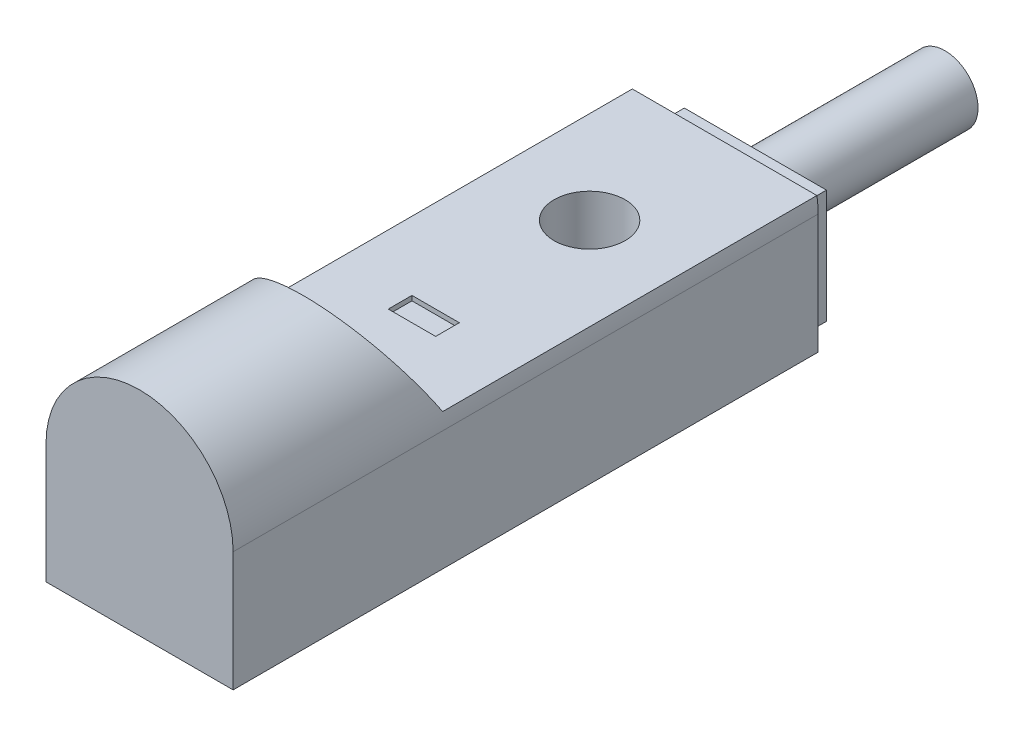
ISO-10303-21;
HEADER;
FILE_DESCRIPTION(('STEP AP214'),'2;1');
FILE_NAME('part.step','',(''),(''),'','','');
FILE_SCHEMA(('AUTOMOTIVE_DESIGN { 1 0 10303 214 1 1 1 1 }'));
ENDSEC;
DATA;
#1=APPLICATION_CONTEXT('core data for automotive mechanical design processes');
#2=APPLICATION_PROTOCOL_DEFINITION('international standard','automotive_design',2000,#1);
#3=PRODUCT_CONTEXT('',#1,'mechanical');
#4=PRODUCT('Part','Part','',(#3));
#5=PRODUCT_RELATED_PRODUCT_CATEGORY('part','',(#4));
#6=PRODUCT_DEFINITION_FORMATION('','',#4);
#7=PRODUCT_DEFINITION_CONTEXT('part definition',#1,'design');
#8=PRODUCT_DEFINITION('design','',#6,#7);
#9=PRODUCT_DEFINITION_SHAPE('','',#8);
#10=(LENGTH_UNIT() NAMED_UNIT(*) SI_UNIT(.MILLI.,.METRE.));
#11=(NAMED_UNIT(*) PLANE_ANGLE_UNIT() SI_UNIT($,.RADIAN.));
#12=(NAMED_UNIT(*) SI_UNIT($,.STERADIAN.) SOLID_ANGLE_UNIT());
#13=UNCERTAINTY_MEASURE_WITH_UNIT(LENGTH_MEASURE(1.E-05),#10,'distance_accuracy_value','');
#14=(GEOMETRIC_REPRESENTATION_CONTEXT(3) GLOBAL_UNCERTAINTY_ASSIGNED_CONTEXT((#13)) GLOBAL_UNIT_ASSIGNED_CONTEXT((#10,
#11,#12)) REPRESENTATION_CONTEXT('',''));
#15=CARTESIAN_POINT('',(0.,0.,0.));
#16=DIRECTION('',(0.,0.,1.));
#17=DIRECTION('',(1.,0.,0.));
#18=AXIS2_PLACEMENT_3D('',#15,#16,#17);
#19=CARTESIAN_POINT('',(0.,5.05,-24.7));
#20=DIRECTION('',(0.,0.,1.));
#21=DIRECTION('',(1.,0.,0.));
#22=AXIS2_PLACEMENT_3D('',#19,#20,#21);
#23=CYLINDRICAL_SURFACE('',#22,3.95);
#24=DIRECTION('',(0.,0.,1.));
#25=VECTOR('',#24,1.);
#26=CARTESIAN_POINT('',(3.89615194775563,5.7,-24.7));
#27=LINE('',#26,#25);
#28=CARTESIAN_POINT('',(3.89615194775563,5.7,-8.9));
#29=VERTEX_POINT('',#28);
#30=CARTESIAN_POINT('',(3.89615194775563,5.7,-24.7));
#31=VERTEX_POINT('',#30);
#32=EDGE_CURVE('E215',#29,#31,#27,.F.);
#33=ORIENTED_EDGE('',*,*,#32,.F.);
#34=CARTESIAN_POINT('',(0.,5.05,-9.2939393939394));
#35=DIRECTION('',(0.,-0.518301716093344,0.855197831554018));
#36=DIRECTION('',(0.,0.855197831554018,0.518301716093344));
#37=AXIS2_PLACEMENT_3D('',#34,#35,#36);
#38=ELLIPSE('',#37,4.61881433074062,3.95);
#39=CARTESIAN_POINT('',(-3.89615194775563,5.7,-8.9));
#40=VERTEX_POINT('',#39);
#41=EDGE_CURVE('E38',#40,#29,#38,.F.);
#42=ORIENTED_EDGE('',*,*,#41,.F.);
#43=DIRECTION('',(0.,0.,1.));
#44=VECTOR('',#43,1.);
#45=CARTESIAN_POINT('',(-3.89615194775563,5.7,-24.7));
#46=LINE('',#45,#44);
#47=CARTESIAN_POINT('',(-3.89615194775563,5.7,-24.7));
#48=VERTEX_POINT('',#47);
#49=EDGE_CURVE('E213',#48,#40,#46,.T.);
#50=ORIENTED_EDGE('',*,*,#49,.F.);
#51=CARTESIAN_POINT('',(0.,5.05,-24.7));
#52=DIRECTION('',(0.,0.,1.));
#53=DIRECTION('',(-1.,0.,0.));
#54=AXIS2_PLACEMENT_3D('',#51,#52,#53);
#55=CIRCLE('',#54,3.95);
#56=CARTESIAN_POINT('',(-3.95,5.05,-24.7));
#57=VERTEX_POINT('',#56);
#58=EDGE_CURVE('E222',#48,#57,#55,.T.);
#59=ORIENTED_EDGE('',*,*,#58,.T.);
#60=DIRECTION('',(0.,0.,1.));
#61=VECTOR('',#60,1.);
#62=CARTESIAN_POINT('',(-3.95,5.05,-24.7));
#63=LINE('',#62,#61);
#64=CARTESIAN_POINT('',(-3.95,5.05,0.));
#65=VERTEX_POINT('',#64);
#66=EDGE_CURVE('E232',#57,#65,#63,.T.);
#67=ORIENTED_EDGE('',*,*,#66,.T.);
#68=CARTESIAN_POINT('',(0.,5.05,0.));
#69=DIRECTION('',(0.,0.,1.));
#70=DIRECTION('',(-1.,0.,0.));
#71=AXIS2_PLACEMENT_3D('',#68,#69,#70);
#72=CIRCLE('',#71,3.95);
#73=CARTESIAN_POINT('',(3.95,5.05,0.));
#74=VERTEX_POINT('',#73);
#75=EDGE_CURVE('E217',#74,#65,#72,.T.);
#76=ORIENTED_EDGE('',*,*,#75,.F.);
#77=DIRECTION('',(0.,0.,1.));
#78=VECTOR('',#77,1.);
#79=CARTESIAN_POINT('',(3.95,5.05,-24.7));
#80=LINE('',#79,#78);
#81=CARTESIAN_POINT('',(3.95,5.05,-24.7));
#82=VERTEX_POINT('',#81);
#83=EDGE_CURVE('E244',#82,#74,#80,.T.);
#84=ORIENTED_EDGE('',*,*,#83,.F.);
#85=EDGE_CURVE('E218',#82,#31,#55,.T.);
#86=ORIENTED_EDGE('',*,*,#85,.T.);
#87=EDGE_LOOP('',(#33,#42,#50,#59,#67,#76,#84,#86));
#88=FACE_BOUND('',#87,.T.);
#89=ADVANCED_FACE('F35',(#88),#23,.T.);
#90=CARTESIAN_POINT('',(3.95,5.05,-24.7));
#91=DIRECTION('',(1.,0.,0.));
#92=DIRECTION('',(0.,1.,0.));
#93=AXIS2_PLACEMENT_3D('',#90,#91,#92);
#94=PLANE('',#93);
#95=DIRECTION('',(0.,1.,0.));
#96=VECTOR('',#95,1.);
#97=CARTESIAN_POINT('',(3.95,5.05,0.));
#98=LINE('',#97,#96);
#99=CARTESIAN_POINT('',(3.95,0.,0.));
#100=VERTEX_POINT('',#99);
#101=EDGE_CURVE('E241',#100,#74,#98,.T.);
#102=ORIENTED_EDGE('',*,*,#101,.F.);
#103=DIRECTION('',(0.,0.,1.));
#104=VECTOR('',#103,1.);
#105=CARTESIAN_POINT('',(3.95,0.,-24.7));
#106=LINE('',#105,#104);
#107=CARTESIAN_POINT('',(3.95,0.,-24.7));
#108=VERTEX_POINT('',#107);
#109=EDGE_CURVE('E247',#108,#100,#106,.T.);
#110=ORIENTED_EDGE('',*,*,#109,.F.);
#111=DIRECTION('',(0.,1.,0.));
#112=VECTOR('',#111,1.);
#113=CARTESIAN_POINT('',(3.95,5.05,-24.7));
#114=LINE('',#113,#112);
#115=EDGE_CURVE('E229',#108,#82,#114,.T.);
#116=ORIENTED_EDGE('',*,*,#115,.T.);
#117=ORIENTED_EDGE('',*,*,#83,.T.);
#118=EDGE_LOOP('',(#102,#110,#116,#117));
#119=FACE_BOUND('',#118,.T.);
#120=ADVANCED_FACE('F269',(#119),#94,.T.);
#121=CARTESIAN_POINT('',(-3.95,0.,-24.7));
#122=DIRECTION('',(0.,-1.,0.));
#123=DIRECTION('',(0.,0.,-1.));
#124=AXIS2_PLACEMENT_3D('',#121,#122,#123);
#125=PLANE('',#124);
#126=CARTESIAN_POINT('',(0.,0.,-19.));
#127=DIRECTION('',(0.,1.,0.));
#128=DIRECTION('',(0.,0.,1.));
#129=AXIS2_PLACEMENT_3D('',#126,#127,#128);
#130=CIRCLE('',#129,1.5);
#131=CARTESIAN_POINT('',(0.,0.,-17.5));
#132=VERTEX_POINT('',#131);
#133=EDGE_CURVE('E207',#132,#132,#130,.T.);
#134=ORIENTED_EDGE('',*,*,#133,.T.);
#135=EDGE_LOOP('',(#134));
#136=FACE_BOUND('',#135,.T.);
#137=DIRECTION('',(1.,0.,0.));
#138=VECTOR('',#137,1.);
#139=CARTESIAN_POINT('',(-3.95,0.,0.));
#140=LINE('',#139,#138);
#141=CARTESIAN_POINT('',(-3.95,0.,0.));
#142=VERTEX_POINT('',#141);
#143=EDGE_CURVE('E238',#142,#100,#140,.T.);
#144=ORIENTED_EDGE('',*,*,#143,.F.);
#145=DIRECTION('',(0.,0.,1.));
#146=VECTOR('',#145,1.);
#147=CARTESIAN_POINT('',(-3.95,0.,-24.7));
#148=LINE('',#147,#146);
#149=CARTESIAN_POINT('',(-3.95,0.,-24.7));
#150=VERTEX_POINT('',#149);
#151=EDGE_CURVE('E249',#150,#142,#148,.T.);
#152=ORIENTED_EDGE('',*,*,#151,.F.);
#153=DIRECTION('',(1.,0.,0.));
#154=VECTOR('',#153,1.);
#155=CARTESIAN_POINT('',(-3.95,0.,-24.7));
#156=LINE('',#155,#154);
#157=CARTESIAN_POINT('',(-3.,0.,-24.7));
#158=VERTEX_POINT('',#157);
#159=EDGE_CURVE('E226',#150,#158,#156,.T.);
#160=ORIENTED_EDGE('',*,*,#159,.T.);
#161=DIRECTION('',(0.,0.,1.));
#162=VECTOR('',#161,1.);
#163=CARTESIAN_POINT('',(-3.,0.,-26.));
#164=LINE('',#163,#162);
#165=CARTESIAN_POINT('',(-3.,0.,-26.));
#166=VERTEX_POINT('',#165);
#167=EDGE_CURVE('E198',#166,#158,#164,.T.);
#168=ORIENTED_EDGE('',*,*,#167,.F.);
#169=DIRECTION('',(-1.,0.,0.));
#170=VECTOR('',#169,1.);
#171=CARTESIAN_POINT('',(3.,0.,-26.));
#172=LINE('',#171,#170);
#173=CARTESIAN_POINT('',(3.,0.,-26.));
#174=VERTEX_POINT('',#173);
#175=EDGE_CURVE('E180',#174,#166,#172,.T.);
#176=ORIENTED_EDGE('',*,*,#175,.F.);
#177=DIRECTION('',(0.,0.,1.));
#178=VECTOR('',#177,1.);
#179=CARTESIAN_POINT('',(3.,0.,-26.));
#180=LINE('',#179,#178);
#181=CARTESIAN_POINT('',(3.,0.,-24.7));
#182=VERTEX_POINT('',#181);
#183=EDGE_CURVE('E201',#174,#182,#180,.T.);
#184=ORIENTED_EDGE('',*,*,#183,.T.);
#185=EDGE_CURVE('E225',#182,#108,#156,.T.);
#186=ORIENTED_EDGE('',*,*,#185,.T.);
#187=ORIENTED_EDGE('',*,*,#109,.T.);
#188=EDGE_LOOP('',(#144,#152,#160,#168,#176,#184,#186,#187));
#189=FACE_BOUND('',#188,.T.);
#190=ADVANCED_FACE('F272',(#136,#189),#125,.T.);
#191=CARTESIAN_POINT('',(-3.95,5.05,-24.7));
#192=DIRECTION('',(-1.,0.,0.));
#193=DIRECTION('',(0.,-1.,0.));
#194=AXIS2_PLACEMENT_3D('',#191,#192,#193);
#195=PLANE('',#194);
#196=DIRECTION('',(0.,-1.,0.));
#197=VECTOR('',#196,1.);
#198=CARTESIAN_POINT('',(-3.95,5.05,0.));
#199=LINE('',#198,#197);
#200=EDGE_CURVE('E235',#65,#142,#199,.T.);
#201=ORIENTED_EDGE('',*,*,#200,.F.);
#202=ORIENTED_EDGE('',*,*,#66,.F.);
#203=DIRECTION('',(0.,-1.,0.));
#204=VECTOR('',#203,1.);
#205=CARTESIAN_POINT('',(-3.95,5.05,-24.7));
#206=LINE('',#205,#204);
#207=EDGE_CURVE('E221',#57,#150,#206,.T.);
#208=ORIENTED_EDGE('',*,*,#207,.T.);
#209=ORIENTED_EDGE('',*,*,#151,.T.);
#210=EDGE_LOOP('',(#201,#202,#208,#209));
#211=FACE_BOUND('',#210,.T.);
#212=ADVANCED_FACE('F278',(#211),#195,.T.);
#213=CARTESIAN_POINT('',(0.,5.05,-24.7));
#214=DIRECTION('',(0.,0.,-1.));
#215=DIRECTION('',(-1.,0.,0.));
#216=AXIS2_PLACEMENT_3D('',#213,#214,#215);
#217=PLANE('',#216);
#218=DIRECTION('',(0.,-1.,0.));
#219=VECTOR('',#218,1.);
#220=CARTESIAN_POINT('',(3.,4.8,-24.7));
#221=LINE('',#220,#219);
#222=CARTESIAN_POINT('',(3.,4.8,-24.7));
#223=VERTEX_POINT('',#222);
#224=EDGE_CURVE('E58',#223,#182,#221,.T.);
#225=ORIENTED_EDGE('',*,*,#224,.F.);
#226=DIRECTION('',(1.,0.,0.));
#227=VECTOR('',#226,1.);
#228=CARTESIAN_POINT('',(3.,4.8,-24.7));
#229=LINE('',#228,#227);
#230=CARTESIAN_POINT('',(-3.,4.8,-24.7));
#231=VERTEX_POINT('',#230);
#232=EDGE_CURVE('E181',#231,#223,#229,.T.);
#233=ORIENTED_EDGE('',*,*,#232,.F.);
#234=DIRECTION('',(0.,1.,0.));
#235=VECTOR('',#234,1.);
#236=CARTESIAN_POINT('',(-3.,4.8,-24.7));
#237=LINE('',#236,#235);
#238=EDGE_CURVE('E189',#158,#231,#237,.T.);
#239=ORIENTED_EDGE('',*,*,#238,.F.);
#240=ORIENTED_EDGE('',*,*,#159,.F.);
#241=ORIENTED_EDGE('',*,*,#207,.F.);
#242=ORIENTED_EDGE('',*,*,#58,.F.);
#243=DIRECTION('',(-1.,0.,0.));
#244=VECTOR('',#243,1.);
#245=CARTESIAN_POINT('',(0.,5.7,-24.7));
#246=LINE('',#245,#244);
#247=EDGE_CURVE('E246',#31,#48,#246,.T.);
#248=ORIENTED_EDGE('',*,*,#247,.F.);
#249=ORIENTED_EDGE('',*,*,#85,.F.);
#250=ORIENTED_EDGE('',*,*,#115,.F.);
#251=ORIENTED_EDGE('',*,*,#185,.F.);
#252=EDGE_LOOP('',(#225,#233,#239,#240,#241,#242,#248,#249,#250,#251));
#253=FACE_BOUND('',#252,.T.);
#254=ADVANCED_FACE('F264',(#253),#217,.T.);
#255=CARTESIAN_POINT('',(0.,5.05,0.));
#256=DIRECTION('',(0.,0.,-1.));
#257=DIRECTION('',(-1.,0.,0.));
#258=AXIS2_PLACEMENT_3D('',#255,#256,#257);
#259=PLANE('',#258);
#260=ORIENTED_EDGE('',*,*,#75,.T.);
#261=ORIENTED_EDGE('',*,*,#200,.T.);
#262=ORIENTED_EDGE('',*,*,#143,.T.);
#263=ORIENTED_EDGE('',*,*,#101,.T.);
#264=EDGE_LOOP('',(#260,#261,#262,#263));
#265=FACE_BOUND('',#264,.T.);
#266=ADVANCED_FACE('F274',(#265),#259,.F.);
#267=CARTESIAN_POINT('',(-3.95,5.7,-8.9));
#268=DIRECTION('',(0.,-1.,0.));
#269=DIRECTION('',(0.,0.,-1.));
#270=AXIS2_PLACEMENT_3D('',#267,#268,#269);
#271=PLANE('',#270);
#272=DIRECTION('',(1.,0.,0.));
#273=VECTOR('',#272,1.);
#274=CARTESIAN_POINT('',(-1.,5.7,-11.5));
#275=LINE('',#274,#273);
#276=CARTESIAN_POINT('',(-1.,5.7,-11.5));
#277=VERTEX_POINT('',#276);
#278=CARTESIAN_POINT('',(1.,5.7,-11.5));
#279=VERTEX_POINT('',#278);
#280=EDGE_CURVE('E165',#277,#279,#275,.T.);
#281=ORIENTED_EDGE('',*,*,#280,.F.);
#282=DIRECTION('',(0.,0.,1.));
#283=VECTOR('',#282,1.);
#284=CARTESIAN_POINT('',(-1.,5.7,-12.5));
#285=LINE('',#284,#283);
#286=CARTESIAN_POINT('',(-1.,5.7,-12.5));
#287=VERTEX_POINT('',#286);
#288=EDGE_CURVE('E50',#287,#277,#285,.T.);
#289=ORIENTED_EDGE('',*,*,#288,.F.);
#290=DIRECTION('',(-1.,0.,0.));
#291=VECTOR('',#290,1.);
#292=CARTESIAN_POINT('',(-1.,5.7,-12.5));
#293=LINE('',#292,#291);
#294=CARTESIAN_POINT('',(1.,5.7,-12.5));
#295=VERTEX_POINT('',#294);
#296=EDGE_CURVE('E156',#295,#287,#293,.T.);
#297=ORIENTED_EDGE('',*,*,#296,.F.);
#298=DIRECTION('',(0.,0.,-1.));
#299=VECTOR('',#298,1.);
#300=CARTESIAN_POINT('',(1.,5.7,-12.5));
#301=LINE('',#300,#299);
#302=EDGE_CURVE('E159',#279,#295,#301,.T.);
#303=ORIENTED_EDGE('',*,*,#302,.F.);
#304=EDGE_LOOP('',(#281,#289,#297,#303));
#305=FACE_BOUND('',#304,.T.);
#306=CARTESIAN_POINT('',(0.,5.7,-19.));
#307=DIRECTION('',(0.,1.,0.));
#308=DIRECTION('',(0.,0.,1.));
#309=AXIS2_PLACEMENT_3D('',#306,#307,#308);
#310=CIRCLE('',#309,1.5);
#311=CARTESIAN_POINT('',(0.,5.7,-17.5));
#312=VERTEX_POINT('',#311);
#313=EDGE_CURVE('E204',#312,#312,#310,.T.);
#314=ORIENTED_EDGE('',*,*,#313,.F.);
#315=EDGE_LOOP('',(#314));
#316=FACE_BOUND('',#315,.T.);
#317=ORIENTED_EDGE('',*,*,#32,.T.);
#318=ORIENTED_EDGE('',*,*,#247,.T.);
#319=ORIENTED_EDGE('',*,*,#49,.T.);
#320=DIRECTION('',(1.,0.,0.));
#321=VECTOR('',#320,1.);
#322=CARTESIAN_POINT('',(-3.95,5.7,-8.9));
#323=LINE('',#322,#321);
#324=EDGE_CURVE('E210',#40,#29,#323,.T.);
#325=ORIENTED_EDGE('',*,*,#324,.T.);
#326=EDGE_LOOP('',(#317,#318,#319,#325));
#327=FACE_BOUND('',#326,.T.);
#328=ADVANCED_FACE('F260',(#305,#316,#327),#271,.F.);
#329=CARTESIAN_POINT('',(-3.95,9.,-6.9));
#330=DIRECTION('',(0.,-0.518301716093344,0.855197831554018));
#331=DIRECTION('',(0.,-0.855197831554018,-0.518301716093344));
#332=AXIS2_PLACEMENT_3D('',#329,#330,#331);
#333=PLANE('',#332);
#334=ORIENTED_EDGE('',*,*,#41,.T.);
#335=ORIENTED_EDGE('',*,*,#324,.F.);
#336=EDGE_LOOP('',(#334,#335));
#337=FACE_BOUND('',#336,.T.);
#338=ADVANCED_FACE('F257',(#337),#333,.F.);
#339=CARTESIAN_POINT('',(0.,5.7,-19.));
#340=DIRECTION('',(0.,1.,0.));
#341=DIRECTION('',(0.,0.,1.));
#342=AXIS2_PLACEMENT_3D('',#339,#340,#341);
#343=CYLINDRICAL_SURFACE('',#342,1.5);
#344=ORIENTED_EDGE('',*,*,#133,.F.);
#345=EDGE_LOOP('',(#344));
#346=FACE_BOUND('',#345,.T.);
#347=ORIENTED_EDGE('',*,*,#313,.T.);
#348=EDGE_LOOP('',(#347));
#349=FACE_BOUND('',#348,.T.);
#350=ADVANCED_FACE('F297',(#346,#349),#343,.F.);
#351=CARTESIAN_POINT('',(3.,4.8,-26.));
#352=DIRECTION('',(-1.,0.,0.));
#353=DIRECTION('',(0.,-1.,0.));
#354=AXIS2_PLACEMENT_3D('',#351,#352,#353);
#355=PLANE('',#354);
#356=ORIENTED_EDGE('',*,*,#224,.T.);
#357=ORIENTED_EDGE('',*,*,#183,.F.);
#358=DIRECTION('',(0.,-1.,0.));
#359=VECTOR('',#358,1.);
#360=CARTESIAN_POINT('',(3.,4.8,-26.));
#361=LINE('',#360,#359);
#362=CARTESIAN_POINT('',(3.,4.8,-26.));
#363=VERTEX_POINT('',#362);
#364=EDGE_CURVE('E177',#363,#174,#361,.T.);
#365=ORIENTED_EDGE('',*,*,#364,.F.);
#366=DIRECTION('',(0.,0.,1.));
#367=VECTOR('',#366,1.);
#368=CARTESIAN_POINT('',(3.,4.8,-26.));
#369=LINE('',#368,#367);
#370=EDGE_CURVE('E187',#363,#223,#369,.T.);
#371=ORIENTED_EDGE('',*,*,#370,.T.);
#372=EDGE_LOOP('',(#356,#357,#365,#371));
#373=FACE_BOUND('',#372,.T.);
#374=ADVANCED_FACE('F295',(#373),#355,.F.);
#375=CARTESIAN_POINT('',(-3.,4.8,-26.));
#376=DIRECTION('',(1.,0.,0.));
#377=DIRECTION('',(0.,1.,0.));
#378=AXIS2_PLACEMENT_3D('',#375,#376,#377);
#379=PLANE('',#378);
#380=ORIENTED_EDGE('',*,*,#238,.T.);
#381=DIRECTION('',(0.,0.,1.));
#382=VECTOR('',#381,1.);
#383=CARTESIAN_POINT('',(-3.,4.8,-26.));
#384=LINE('',#383,#382);
#385=CARTESIAN_POINT('',(-3.,4.8,-26.));
#386=VERTEX_POINT('',#385);
#387=EDGE_CURVE('E195',#386,#231,#384,.T.);
#388=ORIENTED_EDGE('',*,*,#387,.F.);
#389=DIRECTION('',(0.,1.,0.));
#390=VECTOR('',#389,1.);
#391=CARTESIAN_POINT('',(-3.,4.8,-26.));
#392=LINE('',#391,#390);
#393=EDGE_CURVE('E183',#166,#386,#392,.T.);
#394=ORIENTED_EDGE('',*,*,#393,.F.);
#395=ORIENTED_EDGE('',*,*,#167,.T.);
#396=EDGE_LOOP('',(#380,#388,#394,#395));
#397=FACE_BOUND('',#396,.T.);
#398=ADVANCED_FACE('F284',(#397),#379,.F.);
#399=CARTESIAN_POINT('',(3.,4.8,-26.));
#400=DIRECTION('',(0.,-1.,0.));
#401=DIRECTION('',(0.,0.,-1.));
#402=AXIS2_PLACEMENT_3D('',#399,#400,#401);
#403=PLANE('',#402);
#404=ORIENTED_EDGE('',*,*,#232,.T.);
#405=ORIENTED_EDGE('',*,*,#370,.F.);
#406=DIRECTION('',(1.,0.,0.));
#407=VECTOR('',#406,1.);
#408=CARTESIAN_POINT('',(3.,4.8,-26.));
#409=LINE('',#408,#407);
#410=EDGE_CURVE('E185',#386,#363,#409,.T.);
#411=ORIENTED_EDGE('',*,*,#410,.F.);
#412=ORIENTED_EDGE('',*,*,#387,.T.);
#413=EDGE_LOOP('',(#404,#405,#411,#412));
#414=FACE_BOUND('',#413,.T.);
#415=ADVANCED_FACE('F288',(#414),#403,.F.);
#416=CARTESIAN_POINT('',(0.,0.,-26.));
#417=DIRECTION('',(0.,0.,-1.));
#418=DIRECTION('',(-1.,0.,0.));
#419=AXIS2_PLACEMENT_3D('',#416,#417,#418);
#420=PLANE('',#419);
#421=CARTESIAN_POINT('',(0.,3.,-26.));
#422=DIRECTION('',(0.,0.,-1.));
#423=DIRECTION('',(-1.,0.,0.));
#424=AXIS2_PLACEMENT_3D('',#421,#422,#423);
#425=CIRCLE('',#424,1.4);
#426=CARTESIAN_POINT('',(-1.4,3.,-26.));
#427=VERTEX_POINT('',#426);
#428=EDGE_CURVE('E11',#427,#427,#425,.T.);
#429=ORIENTED_EDGE('',*,*,#428,.F.);
#430=EDGE_LOOP('',(#429));
#431=FACE_BOUND('',#430,.T.);
#432=ORIENTED_EDGE('',*,*,#364,.T.);
#433=ORIENTED_EDGE('',*,*,#175,.T.);
#434=ORIENTED_EDGE('',*,*,#393,.T.);
#435=ORIENTED_EDGE('',*,*,#410,.T.);
#436=EDGE_LOOP('',(#432,#433,#434,#435));
#437=FACE_BOUND('',#436,.T.);
#438=ADVANCED_FACE('F292',(#431,#437),#420,.T.);
#439=CARTESIAN_POINT('',(0.,3.,-34.));
#440=DIRECTION('',(0.,0.,1.));
#441=DIRECTION('',(1.,0.,0.));
#442=AXIS2_PLACEMENT_3D('',#439,#440,#441);
#443=CYLINDRICAL_SURFACE('',#442,1.4);
#444=CARTESIAN_POINT('',(0.,3.,-34.));
#445=DIRECTION('',(0.,0.,-1.));
#446=DIRECTION('',(-1.,0.,0.));
#447=AXIS2_PLACEMENT_3D('',#444,#445,#446);
#448=CIRCLE('',#447,1.4);
#449=CARTESIAN_POINT('',(-1.4,3.,-34.));
#450=VERTEX_POINT('',#449);
#451=EDGE_CURVE('E171',#450,#450,#448,.T.);
#452=ORIENTED_EDGE('',*,*,#451,.F.);
#453=EDGE_LOOP('',(#452));
#454=FACE_BOUND('',#453,.T.);
#455=ORIENTED_EDGE('',*,*,#428,.T.);
#456=EDGE_LOOP('',(#455));
#457=FACE_BOUND('',#456,.T.);
#458=ADVANCED_FACE('F356',(#454,#457),#443,.T.);
#459=CARTESIAN_POINT('',(0.,3.,-34.));
#460=DIRECTION('',(0.,0.,-1.));
#461=DIRECTION('',(-1.,0.,0.));
#462=AXIS2_PLACEMENT_3D('',#459,#460,#461);
#463=PLANE('',#462);
#464=ORIENTED_EDGE('',*,*,#451,.T.);
#465=EDGE_LOOP('',(#464));
#466=FACE_BOUND('',#465,.T.);
#467=ADVANCED_FACE('F348',(#466),#463,.T.);
#468=CARTESIAN_POINT('',(-1.,5.5,-12.5));
#469=DIRECTION('',(-1.,0.,0.));
#470=DIRECTION('',(0.,0.,1.));
#471=AXIS2_PLACEMENT_3D('',#468,#469,#470);
#472=PLANE('',#471);
#473=ORIENTED_EDGE('',*,*,#288,.T.);
#474=DIRECTION('',(0.,1.,0.));
#475=VECTOR('',#474,1.);
#476=CARTESIAN_POINT('',(-1.,5.5,-11.5));
#477=LINE('',#476,#475);
#478=CARTESIAN_POINT('',(-1.,5.5,-11.5));
#479=VERTEX_POINT('',#478);
#480=EDGE_CURVE('E134',#479,#277,#477,.T.);
#481=ORIENTED_EDGE('',*,*,#480,.F.);
#482=DIRECTION('',(0.,0.,1.));
#483=VECTOR('',#482,1.);
#484=CARTESIAN_POINT('',(-1.,5.5,-12.5));
#485=LINE('',#484,#483);
#486=CARTESIAN_POINT('',(-1.,5.5,-12.5));
#487=VERTEX_POINT('',#486);
#488=EDGE_CURVE('E138',#487,#479,#485,.T.);
#489=ORIENTED_EDGE('',*,*,#488,.F.);
#490=DIRECTION('',(0.,1.,0.));
#491=VECTOR('',#490,1.);
#492=CARTESIAN_POINT('',(-1.,5.5,-12.5));
#493=LINE('',#492,#491);
#494=EDGE_CURVE('E169',#487,#287,#493,.T.);
#495=ORIENTED_EDGE('',*,*,#494,.T.);
#496=EDGE_LOOP('',(#473,#481,#489,#495));
#497=FACE_BOUND('',#496,.T.);
#498=ADVANCED_FACE('F136',(#497),#472,.F.);
#499=CARTESIAN_POINT('',(-1.,5.5,-12.5));
#500=DIRECTION('',(0.,0.,-1.));
#501=DIRECTION('',(-1.,0.,0.));
#502=AXIS2_PLACEMENT_3D('',#499,#500,#501);
#503=PLANE('',#502);
#504=ORIENTED_EDGE('',*,*,#296,.T.);
#505=ORIENTED_EDGE('',*,*,#494,.F.);
#506=DIRECTION('',(-1.,0.,0.));
#507=VECTOR('',#506,1.);
#508=CARTESIAN_POINT('',(-1.,5.5,-12.5));
#509=LINE('',#508,#507);
#510=CARTESIAN_POINT('',(1.,5.5,-12.5));
#511=VERTEX_POINT('',#510);
#512=EDGE_CURVE('E144',#511,#487,#509,.T.);
#513=ORIENTED_EDGE('',*,*,#512,.F.);
#514=DIRECTION('',(0.,1.,0.));
#515=VECTOR('',#514,1.);
#516=CARTESIAN_POINT('',(1.,5.5,-12.5));
#517=LINE('',#516,#515);
#518=EDGE_CURVE('E172',#511,#295,#517,.T.);
#519=ORIENTED_EDGE('',*,*,#518,.T.);
#520=EDGE_LOOP('',(#504,#505,#513,#519));
#521=FACE_BOUND('',#520,.T.);
#522=ADVANCED_FACE('F340',(#521),#503,.F.);
#523=CARTESIAN_POINT('',(1.,5.5,-12.5));
#524=DIRECTION('',(1.,0.,0.));
#525=DIRECTION('',(0.,0.,-1.));
#526=AXIS2_PLACEMENT_3D('',#523,#524,#525);
#527=PLANE('',#526);
#528=ORIENTED_EDGE('',*,*,#302,.T.);
#529=ORIENTED_EDGE('',*,*,#518,.F.);
#530=DIRECTION('',(0.,0.,-1.));
#531=VECTOR('',#530,1.);
#532=CARTESIAN_POINT('',(1.,5.5,-12.5));
#533=LINE('',#532,#531);
#534=CARTESIAN_POINT('',(1.,5.5,-11.5));
#535=VERTEX_POINT('',#534);
#536=EDGE_CURVE('E152',#535,#511,#533,.T.);
#537=ORIENTED_EDGE('',*,*,#536,.F.);
#538=DIRECTION('',(0.,1.,0.));
#539=VECTOR('',#538,1.);
#540=CARTESIAN_POINT('',(1.,5.5,-11.5));
#541=LINE('',#540,#539);
#542=EDGE_CURVE('E143',#535,#279,#541,.T.);
#543=ORIENTED_EDGE('',*,*,#542,.T.);
#544=EDGE_LOOP('',(#528,#529,#537,#543));
#545=FACE_BOUND('',#544,.T.);
#546=ADVANCED_FACE('F338',(#545),#527,.F.);
#547=CARTESIAN_POINT('',(-1.,5.5,-11.5));
#548=DIRECTION('',(0.,0.,1.));
#549=DIRECTION('',(1.,0.,0.));
#550=AXIS2_PLACEMENT_3D('',#547,#548,#549);
#551=PLANE('',#550);
#552=ORIENTED_EDGE('',*,*,#280,.T.);
#553=ORIENTED_EDGE('',*,*,#542,.F.);
#554=DIRECTION('',(1.,0.,0.));
#555=VECTOR('',#554,1.);
#556=CARTESIAN_POINT('',(-1.,5.5,-11.5));
#557=LINE('',#556,#555);
#558=EDGE_CURVE('E147',#479,#535,#557,.T.);
#559=ORIENTED_EDGE('',*,*,#558,.F.);
#560=ORIENTED_EDGE('',*,*,#480,.T.);
#561=EDGE_LOOP('',(#552,#553,#559,#560));
#562=FACE_BOUND('',#561,.T.);
#563=ADVANCED_FACE('F148',(#562),#551,.F.);
#564=CARTESIAN_POINT('',(0.,5.5,0.));
#565=DIRECTION('',(0.,1.,0.));
#566=DIRECTION('',(0.,0.,1.));
#567=AXIS2_PLACEMENT_3D('',#564,#565,#566);
#568=PLANE('',#567);
#569=ORIENTED_EDGE('',*,*,#488,.T.);
#570=ORIENTED_EDGE('',*,*,#558,.T.);
#571=ORIENTED_EDGE('',*,*,#536,.T.);
#572=ORIENTED_EDGE('',*,*,#512,.T.);
#573=EDGE_LOOP('',(#569,#570,#571,#572));
#574=FACE_BOUND('',#573,.T.);
#575=ADVANCED_FACE('F154',(#574),#568,.T.);
#576=CLOSED_SHELL('',(#89,#120,#190,#212,#254,#266,#328,#338,#350,#374,#398,#415,#438,#458,#467,
#498,#522,#546,#563,#575));
#577=MANIFOLD_SOLID_BREP('B2',#576);
#578=ADVANCED_BREP_SHAPE_REPRESENTATION('',(#18,#577),#14);
#579=SHAPE_DEFINITION_REPRESENTATION(#9,#578);
ENDSEC;
END-ISO-10303-21;
